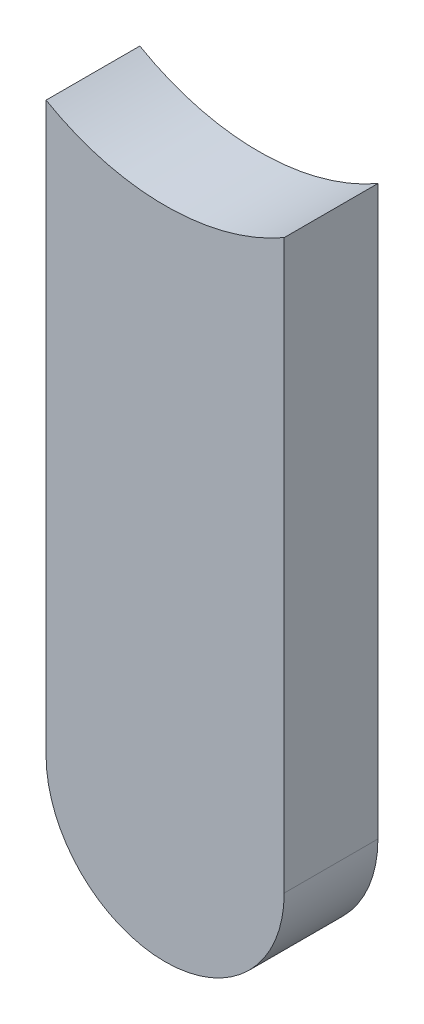
ISO-10303-21;
HEADER;
FILE_DESCRIPTION(('STEP AP214'),'2;1');
FILE_NAME('part.step','',(''),(''),'','','');
FILE_SCHEMA(('AUTOMOTIVE_DESIGN { 1 0 10303 214 1 1 1 1 }'));
ENDSEC;
DATA;
#1=APPLICATION_CONTEXT('core data for automotive mechanical design processes');
#2=APPLICATION_PROTOCOL_DEFINITION('international standard','automotive_design',2000,#1);
#3=PRODUCT_CONTEXT('',#1,'mechanical');
#4=PRODUCT('Part','Part','',(#3));
#5=PRODUCT_RELATED_PRODUCT_CATEGORY('part','',(#4));
#6=PRODUCT_DEFINITION_FORMATION('','',#4);
#7=PRODUCT_DEFINITION_CONTEXT('part definition',#1,'design');
#8=PRODUCT_DEFINITION('design','',#6,#7);
#9=PRODUCT_DEFINITION_SHAPE('','',#8);
#10=(LENGTH_UNIT() NAMED_UNIT(*) SI_UNIT(.MILLI.,.METRE.));
#11=(NAMED_UNIT(*) PLANE_ANGLE_UNIT() SI_UNIT($,.RADIAN.));
#12=(NAMED_UNIT(*) SI_UNIT($,.STERADIAN.) SOLID_ANGLE_UNIT());
#13=UNCERTAINTY_MEASURE_WITH_UNIT(LENGTH_MEASURE(1.E-05),#10,'distance_accuracy_value','');
#14=(GEOMETRIC_REPRESENTATION_CONTEXT(3) GLOBAL_UNCERTAINTY_ASSIGNED_CONTEXT((#13)) GLOBAL_UNIT_ASSIGNED_CONTEXT((#10,
#11,#12)) REPRESENTATION_CONTEXT('',''));
#15=CARTESIAN_POINT('',(0.,0.,0.));
#16=DIRECTION('',(0.,0.,1.));
#17=DIRECTION('',(1.,0.,0.));
#18=AXIS2_PLACEMENT_3D('',#15,#16,#17);
#19=CARTESIAN_POINT('',(149.352,116.332,0.));
#20=DIRECTION('',(-1.,0.,0.));
#21=DIRECTION('',(0.,1.,0.));
#22=AXIS2_PLACEMENT_3D('',#19,#20,#21);
#23=PLANE('',#22);
#24=DIRECTION('',(0.,1.,0.));
#25=VECTOR('',#24,1.);
#26=CARTESIAN_POINT('',(149.352,116.332,0.1999996));
#27=LINE('',#26,#25);
#28=CARTESIAN_POINT('',(149.352,116.332,0.1999996));
#29=VERTEX_POINT('',#28);
#30=CARTESIAN_POINT('',(149.352,117.543059094878,0.1999996));
#31=VERTEX_POINT('',#30);
#32=EDGE_CURVE('E11',#29,#31,#27,.T.);
#33=ORIENTED_EDGE('',*,*,#32,.F.);
#34=DIRECTION('',(0.,0.,1.));
#35=VECTOR('',#34,1.);
#36=CARTESIAN_POINT('',(149.352,116.332,0.));
#37=LINE('',#36,#35);
#38=CARTESIAN_POINT('',(149.352,116.332,0.));
#39=VERTEX_POINT('',#38);
#40=EDGE_CURVE('E24',#39,#29,#37,.T.);
#41=ORIENTED_EDGE('',*,*,#40,.F.);
#42=DIRECTION('',(0.,1.,0.));
#43=VECTOR('',#42,1.);
#44=CARTESIAN_POINT('',(149.352,116.332,0.));
#45=LINE('',#44,#43);
#46=CARTESIAN_POINT('',(149.352,117.543059094878,0.));
#47=VERTEX_POINT('',#46);
#48=EDGE_CURVE('E75',#39,#47,#45,.T.);
#49=ORIENTED_EDGE('',*,*,#48,.T.);
#50=DIRECTION('',(0.,0.,1.));
#51=VECTOR('',#50,1.);
#52=CARTESIAN_POINT('',(149.352,117.543059094878,0.));
#53=LINE('',#52,#51);
#54=EDGE_CURVE('E37',#47,#31,#53,.T.);
#55=ORIENTED_EDGE('',*,*,#54,.T.);
#56=EDGE_LOOP('',(#33,#41,#49,#55));
#57=FACE_BOUND('',#56,.T.);
#58=ADVANCED_FACE('F17',(#57),#23,.F.);
#59=CARTESIAN_POINT('',(149.098,117.983,0.));
#60=DIRECTION('',(0.,0.,-1.));
#61=DIRECTION('',(1.,0.,0.));
#62=AXIS2_PLACEMENT_3D('',#59,#60,#61);
#63=CYLINDRICAL_SURFACE('',#62,0.508);
#64=DIRECTION('',(0.,0.,1.));
#65=VECTOR('',#64,1.);
#66=CARTESIAN_POINT('',(148.844,117.543059094878,0.));
#67=LINE('',#66,#65);
#68=CARTESIAN_POINT('',(148.844,117.543059094878,0.));
#69=VERTEX_POINT('',#68);
#70=CARTESIAN_POINT('',(148.844,117.543059094878,0.1999996));
#71=VERTEX_POINT('',#70);
#72=EDGE_CURVE('E67',#69,#71,#67,.T.);
#73=ORIENTED_EDGE('',*,*,#72,.T.);
#74=CARTESIAN_POINT('',(149.098,117.983,0.1999996));
#75=DIRECTION('',(0.,0.,1.));
#76=DIRECTION('',(1.,0.,0.));
#77=AXIS2_PLACEMENT_3D('',#74,#75,#76);
#78=CIRCLE('',#77,0.508);
#79=EDGE_CURVE('E82',#71,#31,#78,.T.);
#80=ORIENTED_EDGE('',*,*,#79,.T.);
#81=ORIENTED_EDGE('',*,*,#54,.F.);
#82=CARTESIAN_POINT('',(149.098,117.983,0.));
#83=DIRECTION('',(0.,0.,1.));
#84=DIRECTION('',(1.,0.,0.));
#85=AXIS2_PLACEMENT_3D('',#82,#83,#84);
#86=CIRCLE('',#85,0.508);
#87=EDGE_CURVE('E80',#69,#47,#86,.T.);
#88=ORIENTED_EDGE('',*,*,#87,.F.);
#89=EDGE_LOOP('',(#73,#80,#81,#88));
#90=FACE_BOUND('',#89,.T.);
#91=ADVANCED_FACE('F88',(#90),#63,.F.);
#92=CARTESIAN_POINT('',(148.844,117.543059094878,0.));
#93=DIRECTION('',(1.,0.,0.));
#94=DIRECTION('',(0.,-1.,0.));
#95=AXIS2_PLACEMENT_3D('',#92,#93,#94);
#96=PLANE('',#95);
#97=DIRECTION('',(0.,-1.,0.));
#98=VECTOR('',#97,1.);
#99=CARTESIAN_POINT('',(148.844,117.983,0.1999996));
#100=LINE('',#99,#98);
#101=CARTESIAN_POINT('',(148.844,116.332,0.1999996));
#102=VERTEX_POINT('',#101);
#103=EDGE_CURVE('E71',#71,#102,#100,.T.);
#104=ORIENTED_EDGE('',*,*,#103,.F.);
#105=ORIENTED_EDGE('',*,*,#72,.F.);
#106=DIRECTION('',(0.,-1.,0.));
#107=VECTOR('',#106,1.);
#108=CARTESIAN_POINT('',(148.844,117.983,0.));
#109=LINE('',#108,#107);
#110=CARTESIAN_POINT('',(148.844,116.332,0.));
#111=VERTEX_POINT('',#110);
#112=EDGE_CURVE('E63',#69,#111,#109,.T.);
#113=ORIENTED_EDGE('',*,*,#112,.T.);
#114=DIRECTION('',(0.,0.,1.));
#115=VECTOR('',#114,1.);
#116=CARTESIAN_POINT('',(148.844,116.332,0.));
#117=LINE('',#116,#115);
#118=EDGE_CURVE('E53',#111,#102,#117,.T.);
#119=ORIENTED_EDGE('',*,*,#118,.T.);
#120=EDGE_LOOP('',(#104,#105,#113,#119));
#121=FACE_BOUND('',#120,.T.);
#122=ADVANCED_FACE('F66',(#121),#96,.F.);
#123=CARTESIAN_POINT('',(149.098,116.332,0.));
#124=DIRECTION('',(0.,0.,-1.));
#125=DIRECTION('',(-1.,-1.1189649382048E-13,0.));
#126=AXIS2_PLACEMENT_3D('',#123,#124,#125);
#127=CYLINDRICAL_SURFACE('',#126,0.25400000000001);
#128=CARTESIAN_POINT('',(149.098,116.332,0.1999996));
#129=DIRECTION('',(0.,0.,1.));
#130=DIRECTION('',(-1.,-1.1189649382048E-13,0.));
#131=AXIS2_PLACEMENT_3D('',#128,#129,#130);
#132=CIRCLE('',#131,0.25400000000001);
#133=EDGE_CURVE('E59',#102,#29,#132,.T.);
#134=ORIENTED_EDGE('',*,*,#133,.F.);
#135=ORIENTED_EDGE('',*,*,#118,.F.);
#136=CARTESIAN_POINT('',(149.098,116.332,0.));
#137=DIRECTION('',(0.,0.,1.));
#138=DIRECTION('',(-1.,-1.1189649382048E-13,0.));
#139=AXIS2_PLACEMENT_3D('',#136,#137,#138);
#140=CIRCLE('',#139,0.25400000000001);
#141=EDGE_CURVE('E57',#111,#39,#140,.T.);
#142=ORIENTED_EDGE('',*,*,#141,.T.);
#143=ORIENTED_EDGE('',*,*,#40,.T.);
#144=EDGE_LOOP('',(#134,#135,#142,#143));
#145=FACE_BOUND('',#144,.T.);
#146=ADVANCED_FACE('F55',(#145),#127,.T.);
#147=CARTESIAN_POINT('',(149.352,116.332,0.));
#148=DIRECTION('',(0.,0.,-1.));
#149=DIRECTION('',(-1.,0.,0.));
#150=AXIS2_PLACEMENT_3D('',#147,#148,#149);
#151=PLANE('',#150);
#152=ORIENTED_EDGE('',*,*,#48,.F.);
#153=ORIENTED_EDGE('',*,*,#141,.F.);
#154=ORIENTED_EDGE('',*,*,#112,.F.);
#155=ORIENTED_EDGE('',*,*,#87,.T.);
#156=EDGE_LOOP('',(#152,#153,#154,#155));
#157=FACE_BOUND('',#156,.T.);
#158=ADVANCED_FACE('F74',(#157),#151,.T.);
#159=CARTESIAN_POINT('',(149.352,116.332,0.1999996));
#160=DIRECTION('',(0.,0.,-1.));
#161=DIRECTION('',(-1.,0.,0.));
#162=AXIS2_PLACEMENT_3D('',#159,#160,#161);
#163=PLANE('',#162);
#164=ORIENTED_EDGE('',*,*,#133,.T.);
#165=ORIENTED_EDGE('',*,*,#32,.T.);
#166=ORIENTED_EDGE('',*,*,#79,.F.);
#167=ORIENTED_EDGE('',*,*,#103,.T.);
#168=EDGE_LOOP('',(#164,#165,#166,#167));
#169=FACE_BOUND('',#168,.T.);
#170=ADVANCED_FACE('F91',(#169),#163,.F.);
#171=CLOSED_SHELL('',(#58,#91,#122,#146,#158,#170));
#172=MANIFOLD_SOLID_BREP('B1',#171);
#173=ADVANCED_BREP_SHAPE_REPRESENTATION('',(#18,#172),#14);
#174=SHAPE_DEFINITION_REPRESENTATION(#9,#173);
ENDSEC;
END-ISO-10303-21;
